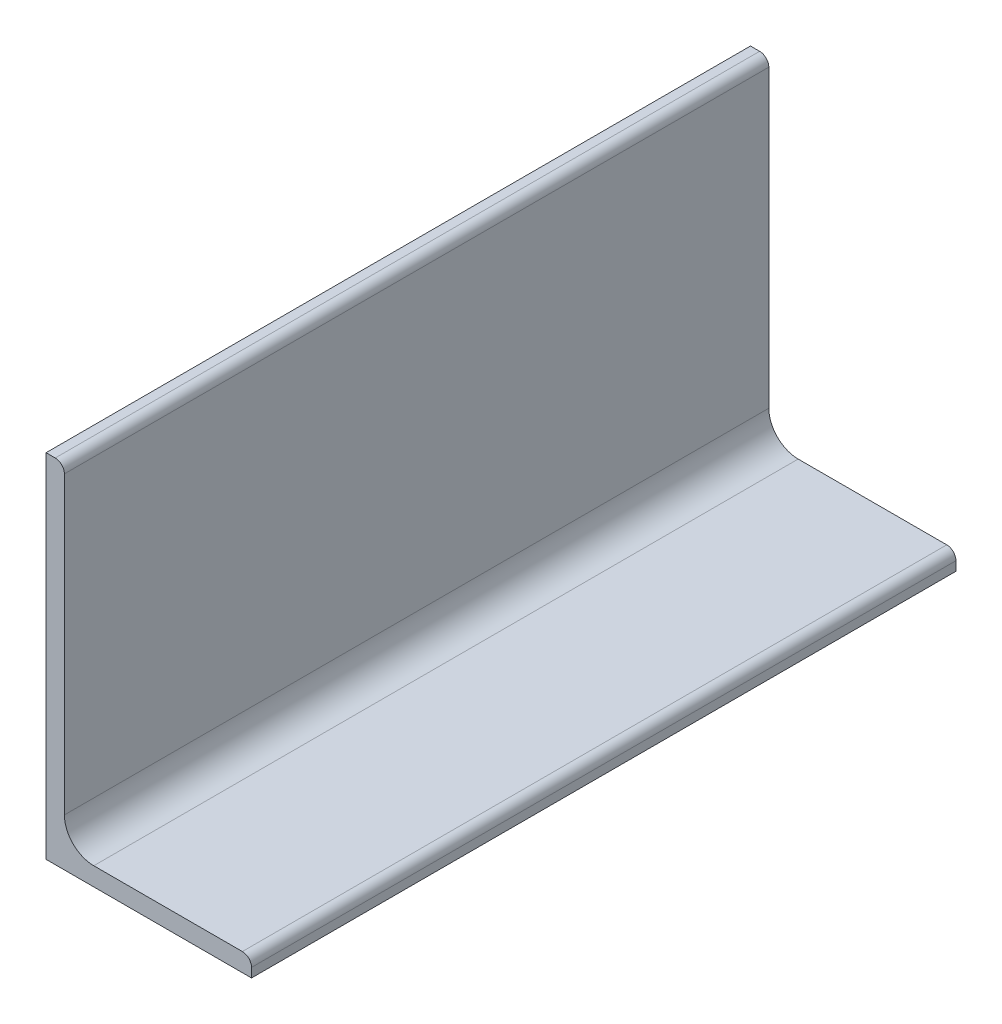
ISO-10303-21;
HEADER;
FILE_DESCRIPTION(('STEP AP214'),'2;1');
FILE_NAME('part.step','',(''),(''),'','','');
FILE_SCHEMA(('AUTOMOTIVE_DESIGN { 1 0 10303 214 1 1 1 1 }'));
ENDSEC;
DATA;
#1=APPLICATION_CONTEXT('core data for automotive mechanical design processes');
#2=APPLICATION_PROTOCOL_DEFINITION('international standard','automotive_design',2000,#1);
#3=PRODUCT_CONTEXT('',#1,'mechanical');
#4=PRODUCT('Part','Part','',(#3));
#5=PRODUCT_RELATED_PRODUCT_CATEGORY('part','',(#4));
#6=PRODUCT_DEFINITION_FORMATION('','',#4);
#7=PRODUCT_DEFINITION_CONTEXT('part definition',#1,'design');
#8=PRODUCT_DEFINITION('design','',#6,#7);
#9=PRODUCT_DEFINITION_SHAPE('','',#8);
#10=(LENGTH_UNIT() NAMED_UNIT(*) SI_UNIT(.MILLI.,.METRE.));
#11=(NAMED_UNIT(*) PLANE_ANGLE_UNIT() SI_UNIT($,.RADIAN.));
#12=(NAMED_UNIT(*) SI_UNIT($,.STERADIAN.) SOLID_ANGLE_UNIT());
#13=UNCERTAINTY_MEASURE_WITH_UNIT(LENGTH_MEASURE(1.E-05),#10,'distance_accuracy_value','');
#14=(GEOMETRIC_REPRESENTATION_CONTEXT(3) GLOBAL_UNCERTAINTY_ASSIGNED_CONTEXT((#13)) GLOBAL_UNIT_ASSIGNED_CONTEXT((#10,
#11,#12)) REPRESENTATION_CONTEXT('',''));
#15=CARTESIAN_POINT('',(0.,0.,0.));
#16=DIRECTION('',(0.,0.,1.));
#17=DIRECTION('',(1.,0.,0.));
#18=AXIS2_PLACEMENT_3D('',#15,#16,#17);
#19=CARTESIAN_POINT('',(0.0836264027816469,152.925428131371,304.8));
#20=DIRECTION('',(1.,0.,0.));
#21=DIRECTION('',(0.,0.,-1.));
#22=AXIS2_PLACEMENT_3D('',#19,#20,#21);
#23=PLANE('',#22);
#24=DIRECTION('',(0.,-1.,0.));
#25=VECTOR('',#24,1.);
#26=CARTESIAN_POINT('',(0.0836264027816469,152.925428131371,0.));
#27=LINE('',#26,#25);
#28=CARTESIAN_POINT('',(0.0836264027816469,152.925428131371,0.));
#29=VERTEX_POINT('',#28);
#30=CARTESIAN_POINT('',(0.0836264027816469,0.525428131371291,0.));
#31=VERTEX_POINT('',#30);
#32=EDGE_CURVE('E135',#29,#31,#27,.T.);
#33=ORIENTED_EDGE('',*,*,#32,.T.);
#34=DIRECTION('',(0.,0.,-1.));
#35=VECTOR('',#34,1.);
#36=CARTESIAN_POINT('',(0.0836264027816469,0.525428131371291,304.8));
#37=LINE('',#36,#35);
#38=CARTESIAN_POINT('',(0.0836264027816469,0.525428131371291,304.8));
#39=VERTEX_POINT('',#38);
#40=EDGE_CURVE('E11',#39,#31,#37,.T.);
#41=ORIENTED_EDGE('',*,*,#40,.F.);
#42=DIRECTION('',(0.,-1.,0.));
#43=VECTOR('',#42,1.);
#44=CARTESIAN_POINT('',(0.0836264027816469,152.925428131371,304.8));
#45=LINE('',#44,#43);
#46=CARTESIAN_POINT('',(0.0836264027816469,152.925428131371,304.8));
#47=VERTEX_POINT('',#46);
#48=EDGE_CURVE('E151',#47,#39,#45,.T.);
#49=ORIENTED_EDGE('',*,*,#48,.F.);
#50=DIRECTION('',(0.,0.,-1.));
#51=VECTOR('',#50,1.);
#52=CARTESIAN_POINT('',(0.0836264027816469,152.925428131371,304.8));
#53=LINE('',#52,#51);
#54=EDGE_CURVE('E131',#47,#29,#53,.T.);
#55=ORIENTED_EDGE('',*,*,#54,.T.);
#56=EDGE_LOOP('',(#33,#41,#49,#55));
#57=FACE_BOUND('',#56,.T.);
#58=ADVANCED_FACE('F33',(#57),#23,.F.);
#59=CARTESIAN_POINT('',(0.0836264027816469,0.525428131371291,304.8));
#60=DIRECTION('',(0.,1.,0.));
#61=DIRECTION('',(0.,0.,1.));
#62=AXIS2_PLACEMENT_3D('',#59,#60,#61);
#63=PLANE('',#62);
#64=DIRECTION('',(1.,0.,0.));
#65=VECTOR('',#64,1.);
#66=CARTESIAN_POINT('',(0.0836264027816469,0.525428131371291,0.));
#67=LINE('',#66,#65);
#68=CARTESIAN_POINT('',(88.9836264027817,0.525428131371291,0.));
#69=VERTEX_POINT('',#68);
#70=EDGE_CURVE('E138',#31,#69,#67,.T.);
#71=ORIENTED_EDGE('',*,*,#70,.T.);
#72=DIRECTION('',(0.,0.,-1.));
#73=VECTOR('',#72,1.);
#74=CARTESIAN_POINT('',(88.9836264027817,0.525428131371291,304.8));
#75=LINE('',#74,#73);
#76=CARTESIAN_POINT('',(88.9836264027817,0.525428131371291,304.8));
#77=VERTEX_POINT('',#76);
#78=EDGE_CURVE('E41',#77,#69,#75,.T.);
#79=ORIENTED_EDGE('',*,*,#78,.F.);
#80=DIRECTION('',(1.,0.,0.));
#81=VECTOR('',#80,1.);
#82=CARTESIAN_POINT('',(0.0836264027816469,0.525428131371291,304.8));
#83=LINE('',#82,#81);
#84=EDGE_CURVE('E95',#39,#77,#83,.T.);
#85=ORIENTED_EDGE('',*,*,#84,.F.);
#86=ORIENTED_EDGE('',*,*,#40,.T.);
#87=EDGE_LOOP('',(#71,#79,#85,#86));
#88=FACE_BOUND('',#87,.T.);
#89=ADVANCED_FACE('F194',(#88),#63,.F.);
#90=CARTESIAN_POINT('',(88.9836264027817,0.525428131371291,304.8));
#91=DIRECTION('',(-1.,0.,0.));
#92=DIRECTION('',(0.,0.,1.));
#93=AXIS2_PLACEMENT_3D('',#90,#91,#92);
#94=PLANE('',#93);
#95=DIRECTION('',(0.,1.,0.));
#96=VECTOR('',#95,1.);
#97=CARTESIAN_POINT('',(88.9836264027817,0.525428131371291,0.));
#98=LINE('',#97,#96);
#99=CARTESIAN_POINT('',(88.9836264027817,4.49417813137129,0.));
#100=VERTEX_POINT('',#99);
#101=EDGE_CURVE('E140',#69,#100,#98,.T.);
#102=ORIENTED_EDGE('',*,*,#101,.T.);
#103=DIRECTION('',(0.,0.,-1.));
#104=VECTOR('',#103,1.);
#105=CARTESIAN_POINT('',(88.9836264027817,4.49417813137129,304.8));
#106=LINE('',#105,#104);
#107=CARTESIAN_POINT('',(88.9836264027817,4.49417813137129,304.8));
#108=VERTEX_POINT('',#107);
#109=EDGE_CURVE('E161',#108,#100,#106,.T.);
#110=ORIENTED_EDGE('',*,*,#109,.F.);
#111=DIRECTION('',(0.,1.,0.));
#112=VECTOR('',#111,1.);
#113=CARTESIAN_POINT('',(88.9836264027817,0.525428131371291,304.8));
#114=LINE('',#113,#112);
#115=EDGE_CURVE('E169',#77,#108,#114,.T.);
#116=ORIENTED_EDGE('',*,*,#115,.F.);
#117=ORIENTED_EDGE('',*,*,#78,.T.);
#118=EDGE_LOOP('',(#102,#110,#116,#117));
#119=FACE_BOUND('',#118,.T.);
#120=ADVANCED_FACE('F167',(#119),#94,.F.);
#121=CARTESIAN_POINT('',(85.0148764027816,4.49417813137129,304.8));
#122=DIRECTION('',(0.,0.,-1.));
#123=DIRECTION('',(-1.,0.,0.));
#124=AXIS2_PLACEMENT_3D('',#121,#122,#123);
#125=CYLINDRICAL_SURFACE('',#124,3.96875);
#126=CARTESIAN_POINT('',(85.0148764027816,4.49417813137129,0.));
#127=DIRECTION('',(0.,0.,1.));
#128=DIRECTION('',(1.,0.,0.));
#129=AXIS2_PLACEMENT_3D('',#126,#127,#128);
#130=CIRCLE('',#129,3.96875);
#131=CARTESIAN_POINT('',(85.0148764027816,8.46292813137129,0.));
#132=VERTEX_POINT('',#131);
#133=EDGE_CURVE('E142',#100,#132,#130,.T.);
#134=ORIENTED_EDGE('',*,*,#133,.T.);
#135=DIRECTION('',(0.,0.,-1.));
#136=VECTOR('',#135,1.);
#137=CARTESIAN_POINT('',(85.0148764027816,8.46292813137129,304.8));
#138=LINE('',#137,#136);
#139=CARTESIAN_POINT('',(85.0148764027816,8.46292813137129,304.8));
#140=VERTEX_POINT('',#139);
#141=EDGE_CURVE('E158',#140,#132,#138,.T.);
#142=ORIENTED_EDGE('',*,*,#141,.F.);
#143=CARTESIAN_POINT('',(85.0148764027816,4.49417813137129,304.8));
#144=DIRECTION('',(0.,0.,1.));
#145=DIRECTION('',(1.,0.,0.));
#146=AXIS2_PLACEMENT_3D('',#143,#144,#145);
#147=CIRCLE('',#146,3.96875);
#148=EDGE_CURVE('E185',#108,#140,#147,.T.);
#149=ORIENTED_EDGE('',*,*,#148,.F.);
#150=ORIENTED_EDGE('',*,*,#109,.T.);
#151=EDGE_LOOP('',(#134,#142,#149,#150));
#152=FACE_BOUND('',#151,.T.);
#153=ADVANCED_FACE('F178',(#152),#125,.T.);
#154=CARTESIAN_POINT('',(85.0148764027816,8.46292813137129,304.8));
#155=DIRECTION('',(0.,-1.,0.));
#156=DIRECTION('',(0.,0.,-1.));
#157=AXIS2_PLACEMENT_3D('',#154,#155,#156);
#158=PLANE('',#157);
#159=DIRECTION('',(-1.,0.,0.));
#160=VECTOR('',#159,1.);
#161=CARTESIAN_POINT('',(85.0148764027816,8.46292813137129,0.));
#162=LINE('',#161,#160);
#163=CARTESIAN_POINT('',(20.7211264027816,8.46292813137129,0.));
#164=VERTEX_POINT('',#163);
#165=EDGE_CURVE('E144',#132,#164,#162,.T.);
#166=ORIENTED_EDGE('',*,*,#165,.T.);
#167=DIRECTION('',(0.,0.,-1.));
#168=VECTOR('',#167,1.);
#169=CARTESIAN_POINT('',(20.7211264027816,8.46292813137129,304.8));
#170=LINE('',#169,#168);
#171=CARTESIAN_POINT('',(20.7211264027816,8.46292813137129,304.8));
#172=VERTEX_POINT('',#171);
#173=EDGE_CURVE('E155',#172,#164,#170,.T.);
#174=ORIENTED_EDGE('',*,*,#173,.F.);
#175=DIRECTION('',(-1.,0.,0.));
#176=VECTOR('',#175,1.);
#177=CARTESIAN_POINT('',(85.0148764027816,8.46292813137129,304.8));
#178=LINE('',#177,#176);
#179=EDGE_CURVE('E184',#140,#172,#178,.T.);
#180=ORIENTED_EDGE('',*,*,#179,.F.);
#181=ORIENTED_EDGE('',*,*,#141,.T.);
#182=EDGE_LOOP('',(#166,#174,#180,#181));
#183=FACE_BOUND('',#182,.T.);
#184=ADVANCED_FACE('F182',(#183),#158,.F.);
#185=CARTESIAN_POINT('',(20.7211264027816,21.1629281313713,304.8));
#186=DIRECTION('',(0.,0.,-1.));
#187=DIRECTION('',(-1.,0.,0.));
#188=AXIS2_PLACEMENT_3D('',#185,#186,#187);
#189=CYLINDRICAL_SURFACE('',#188,12.7);
#190=CARTESIAN_POINT('',(20.7211264027816,21.1629281313713,0.));
#191=DIRECTION('',(0.,0.,-1.));
#192=DIRECTION('',(1.,0.,0.));
#193=AXIS2_PLACEMENT_3D('',#190,#191,#192);
#194=CIRCLE('',#193,12.7);
#195=CARTESIAN_POINT('',(8.02112640278165,21.1629281313713,0.));
#196=VERTEX_POINT('',#195);
#197=EDGE_CURVE('E146',#164,#196,#194,.T.);
#198=ORIENTED_EDGE('',*,*,#197,.T.);
#199=DIRECTION('',(0.,0.,-1.));
#200=VECTOR('',#199,1.);
#201=CARTESIAN_POINT('',(8.02112640278165,21.1629281313713,304.8));
#202=LINE('',#201,#200);
#203=CARTESIAN_POINT('',(8.02112640278165,21.1629281313713,304.8));
#204=VERTEX_POINT('',#203);
#205=EDGE_CURVE('E126',#204,#196,#202,.T.);
#206=ORIENTED_EDGE('',*,*,#205,.F.);
#207=CARTESIAN_POINT('',(20.7211264027816,21.1629281313713,304.8));
#208=DIRECTION('',(0.,0.,-1.));
#209=DIRECTION('',(1.,0.,0.));
#210=AXIS2_PLACEMENT_3D('',#207,#208,#209);
#211=CIRCLE('',#210,12.7);
#212=EDGE_CURVE('E117',#172,#204,#211,.T.);
#213=ORIENTED_EDGE('',*,*,#212,.F.);
#214=ORIENTED_EDGE('',*,*,#173,.T.);
#215=EDGE_LOOP('',(#198,#206,#213,#214));
#216=FACE_BOUND('',#215,.T.);
#217=ADVANCED_FACE('F206',(#216),#189,.F.);
#218=CARTESIAN_POINT('',(8.02112640278165,21.1629281313713,304.8));
#219=DIRECTION('',(-1.,0.,0.));
#220=DIRECTION('',(0.,0.,1.));
#221=AXIS2_PLACEMENT_3D('',#218,#219,#220);
#222=PLANE('',#221);
#223=DIRECTION('',(0.,1.,0.));
#224=VECTOR('',#223,1.);
#225=CARTESIAN_POINT('',(8.02112640278165,21.1629281313713,0.));
#226=LINE('',#225,#224);
#227=CARTESIAN_POINT('',(8.02112640278165,148.956678131371,0.));
#228=VERTEX_POINT('',#227);
#229=EDGE_CURVE('E125',#196,#228,#226,.T.);
#230=ORIENTED_EDGE('',*,*,#229,.T.);
#231=DIRECTION('',(0.,0.,-1.));
#232=VECTOR('',#231,1.);
#233=CARTESIAN_POINT('',(8.02112640278165,148.956678131371,304.8));
#234=LINE('',#233,#232);
#235=CARTESIAN_POINT('',(8.02112640278165,148.956678131371,304.8));
#236=VERTEX_POINT('',#235);
#237=EDGE_CURVE('E122',#236,#228,#234,.T.);
#238=ORIENTED_EDGE('',*,*,#237,.F.);
#239=DIRECTION('',(0.,1.,0.));
#240=VECTOR('',#239,1.);
#241=CARTESIAN_POINT('',(8.02112640278165,21.1629281313713,304.8));
#242=LINE('',#241,#240);
#243=EDGE_CURVE('E111',#204,#236,#242,.T.);
#244=ORIENTED_EDGE('',*,*,#243,.F.);
#245=ORIENTED_EDGE('',*,*,#205,.T.);
#246=EDGE_LOOP('',(#230,#238,#244,#245));
#247=FACE_BOUND('',#246,.T.);
#248=ADVANCED_FACE('F123',(#247),#222,.F.);
#249=CARTESIAN_POINT('',(4.05237640278164,148.956678131371,304.8));
#250=DIRECTION('',(0.,0.,-1.));
#251=DIRECTION('',(-1.,0.,0.));
#252=AXIS2_PLACEMENT_3D('',#249,#250,#251);
#253=CYLINDRICAL_SURFACE('',#252,3.96875);
#254=CARTESIAN_POINT('',(4.05237640278164,148.956678131371,0.));
#255=DIRECTION('',(0.,0.,1.));
#256=DIRECTION('',(1.,0.,0.));
#257=AXIS2_PLACEMENT_3D('',#254,#255,#256);
#258=CIRCLE('',#257,3.96875);
#259=CARTESIAN_POINT('',(4.05237640278165,152.925428131371,0.));
#260=VERTEX_POINT('',#259);
#261=EDGE_CURVE('E81',#228,#260,#258,.T.);
#262=ORIENTED_EDGE('',*,*,#261,.T.);
#263=DIRECTION('',(0.,0.,-1.));
#264=VECTOR('',#263,1.);
#265=CARTESIAN_POINT('',(4.05237640278165,152.925428131371,304.8));
#266=LINE('',#265,#264);
#267=CARTESIAN_POINT('',(4.05237640278165,152.925428131371,304.8));
#268=VERTEX_POINT('',#267);
#269=EDGE_CURVE('E127',#268,#260,#266,.T.);
#270=ORIENTED_EDGE('',*,*,#269,.F.);
#271=CARTESIAN_POINT('',(4.05237640278164,148.956678131371,304.8));
#272=DIRECTION('',(0.,0.,1.));
#273=DIRECTION('',(1.,0.,0.));
#274=AXIS2_PLACEMENT_3D('',#271,#272,#273);
#275=CIRCLE('',#274,3.96875);
#276=EDGE_CURVE('E115',#236,#268,#275,.T.);
#277=ORIENTED_EDGE('',*,*,#276,.F.);
#278=ORIENTED_EDGE('',*,*,#237,.T.);
#279=EDGE_LOOP('',(#262,#270,#277,#278));
#280=FACE_BOUND('',#279,.T.);
#281=ADVANCED_FACE('F129',(#280),#253,.T.);
#282=CARTESIAN_POINT('',(4.05237640278165,152.925428131371,304.8));
#283=DIRECTION('',(0.,-1.,0.));
#284=DIRECTION('',(0.,0.,-1.));
#285=AXIS2_PLACEMENT_3D('',#282,#283,#284);
#286=PLANE('',#285);
#287=DIRECTION('',(-1.,0.,0.));
#288=VECTOR('',#287,1.);
#289=CARTESIAN_POINT('',(4.05237640278165,152.925428131371,0.));
#290=LINE('',#289,#288);
#291=EDGE_CURVE('E87',#260,#29,#290,.T.);
#292=ORIENTED_EDGE('',*,*,#291,.T.);
#293=ORIENTED_EDGE('',*,*,#54,.F.);
#294=DIRECTION('',(-1.,0.,0.));
#295=VECTOR('',#294,1.);
#296=CARTESIAN_POINT('',(4.05237640278165,152.925428131371,304.8));
#297=LINE('',#296,#295);
#298=EDGE_CURVE('E49',#268,#47,#297,.T.);
#299=ORIENTED_EDGE('',*,*,#298,.F.);
#300=ORIENTED_EDGE('',*,*,#269,.T.);
#301=EDGE_LOOP('',(#292,#293,#299,#300));
#302=FACE_BOUND('',#301,.T.);
#303=ADVANCED_FACE('F214',(#302),#286,.F.);
#304=CARTESIAN_POINT('',(85.0148764027816,4.49417813137129,304.8));
#305=DIRECTION('',(0.,0.,1.));
#306=DIRECTION('',(1.,0.,0.));
#307=AXIS2_PLACEMENT_3D('',#304,#305,#306);
#308=PLANE('',#307);
#309=ORIENTED_EDGE('',*,*,#48,.T.);
#310=ORIENTED_EDGE('',*,*,#84,.T.);
#311=ORIENTED_EDGE('',*,*,#115,.T.);
#312=ORIENTED_EDGE('',*,*,#148,.T.);
#313=ORIENTED_EDGE('',*,*,#179,.T.);
#314=ORIENTED_EDGE('',*,*,#212,.T.);
#315=ORIENTED_EDGE('',*,*,#243,.T.);
#316=ORIENTED_EDGE('',*,*,#276,.T.);
#317=ORIENTED_EDGE('',*,*,#298,.T.);
#318=EDGE_LOOP('',(#309,#310,#311,#312,#313,#314,#315,#316,#317));
#319=FACE_BOUND('',#318,.T.);
#320=ADVANCED_FACE('F113',(#319),#308,.T.);
#321=CARTESIAN_POINT('',(85.0148764027816,4.49417813137129,0.));
#322=DIRECTION('',(0.,0.,1.));
#323=DIRECTION('',(1.,0.,0.));
#324=AXIS2_PLACEMENT_3D('',#321,#322,#323);
#325=PLANE('',#324);
#326=ORIENTED_EDGE('',*,*,#32,.F.);
#327=ORIENTED_EDGE('',*,*,#291,.F.);
#328=ORIENTED_EDGE('',*,*,#261,.F.);
#329=ORIENTED_EDGE('',*,*,#229,.F.);
#330=ORIENTED_EDGE('',*,*,#197,.F.);
#331=ORIENTED_EDGE('',*,*,#165,.F.);
#332=ORIENTED_EDGE('',*,*,#133,.F.);
#333=ORIENTED_EDGE('',*,*,#101,.F.);
#334=ORIENTED_EDGE('',*,*,#70,.F.);
#335=EDGE_LOOP('',(#326,#327,#328,#329,#330,#331,#332,#333,#334));
#336=FACE_BOUND('',#335,.T.);
#337=ADVANCED_FACE('F173',(#336),#325,.F.);
#338=CLOSED_SHELL('',(#58,#89,#120,#153,#184,#217,#248,#281,#303,#320,#337));
#339=MANIFOLD_SOLID_BREP('B2',#338);
#340=ADVANCED_BREP_SHAPE_REPRESENTATION('',(#18,#339),#14);
#341=SHAPE_DEFINITION_REPRESENTATION(#9,#340);
ENDSEC;
END-ISO-10303-21;
